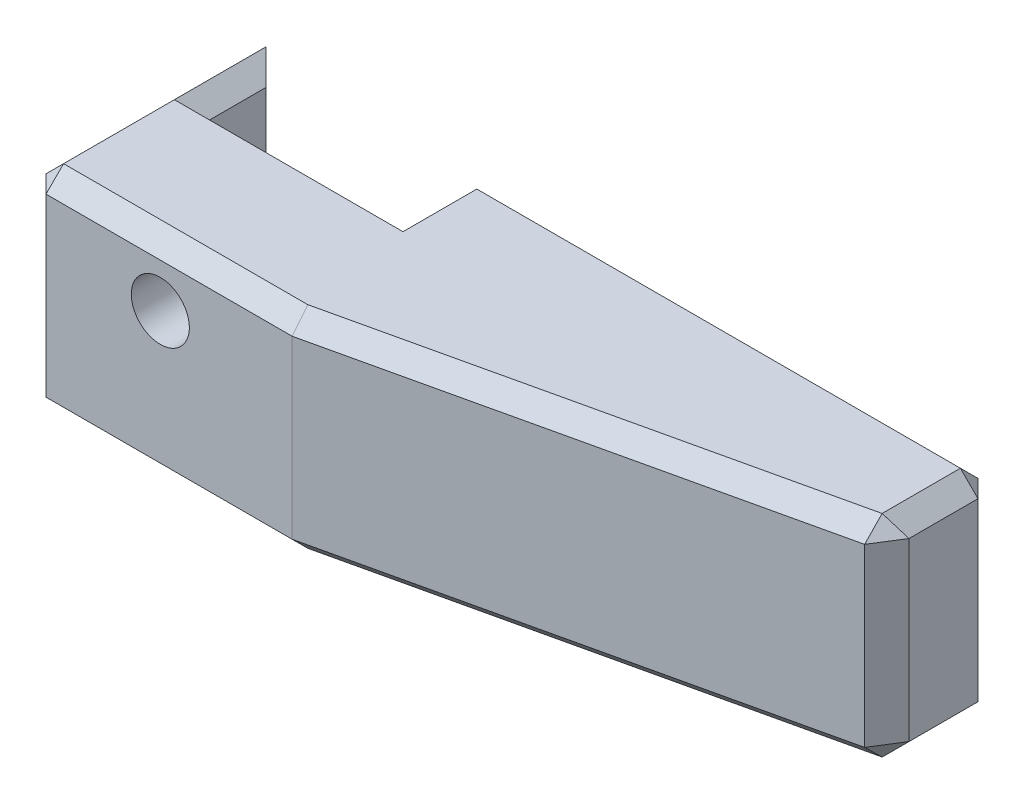
ISO-10303-21;
HEADER;
FILE_DESCRIPTION(('STEP AP214'),'2;1');
FILE_NAME('part.step','',(''),(''),'','','');
FILE_SCHEMA(('AUTOMOTIVE_DESIGN { 1 0 10303 214 1 1 1 1 }'));
ENDSEC;
DATA;
#1=APPLICATION_CONTEXT('core data for automotive mechanical design processes');
#2=APPLICATION_PROTOCOL_DEFINITION('international standard','automotive_design',2000,#1);
#3=PRODUCT_CONTEXT('',#1,'mechanical');
#4=PRODUCT('Part','Part','',(#3));
#5=PRODUCT_RELATED_PRODUCT_CATEGORY('part','',(#4));
#6=PRODUCT_DEFINITION_FORMATION('','',#4);
#7=PRODUCT_DEFINITION_CONTEXT('part definition',#1,'design');
#8=PRODUCT_DEFINITION('design','',#6,#7);
#9=PRODUCT_DEFINITION_SHAPE('','',#8);
#10=(LENGTH_UNIT() NAMED_UNIT(*) SI_UNIT(.MILLI.,.METRE.));
#11=(NAMED_UNIT(*) PLANE_ANGLE_UNIT() SI_UNIT($,.RADIAN.));
#12=(NAMED_UNIT(*) SI_UNIT($,.STERADIAN.) SOLID_ANGLE_UNIT());
#13=UNCERTAINTY_MEASURE_WITH_UNIT(LENGTH_MEASURE(1.E-05),#10,'distance_accuracy_value','');
#14=(GEOMETRIC_REPRESENTATION_CONTEXT(3) GLOBAL_UNCERTAINTY_ASSIGNED_CONTEXT((#13)) GLOBAL_UNIT_ASSIGNED_CONTEXT((#10,
#11,#12)) REPRESENTATION_CONTEXT('',''));
#15=CARTESIAN_POINT('',(0.,0.,0.));
#16=DIRECTION('',(0.,0.,1.));
#17=DIRECTION('',(1.,0.,0.));
#18=AXIS2_PLACEMENT_3D('',#15,#16,#17);
#19=CARTESIAN_POINT('',(0.,6.,33.75));
#20=DIRECTION('',(0.,0.,1.));
#21=DIRECTION('',(-1.,0.,0.));
#22=AXIS2_PLACEMENT_3D('',#19,#20,#21);
#23=PLANE('',#22);
#24=DIRECTION('',(0.,1.,0.));
#25=VECTOR('',#24,1.);
#26=CARTESIAN_POINT('',(12.,4.5,33.75));
#27=LINE('',#26,#25);
#28=CARTESIAN_POINT('',(12.,-4.5,33.75));
#29=VERTEX_POINT('',#28);
#30=CARTESIAN_POINT('',(12.,4.5,33.75));
#31=VERTEX_POINT('',#30);
#32=EDGE_CURVE('E1076',#29,#31,#27,.T.);
#33=ORIENTED_EDGE('',*,*,#32,.F.);
#34=DIRECTION('',(-1.,0.,0.));
#35=VECTOR('',#34,1.);
#36=CARTESIAN_POINT('',(12.,-4.5,33.75));
#37=LINE('',#36,#35);
#38=CARTESIAN_POINT('',(38.5,-4.5,33.75));
#39=VERTEX_POINT('',#38);
#40=EDGE_CURVE('E63',#39,#29,#37,.T.);
#41=ORIENTED_EDGE('',*,*,#40,.F.);
#42=DIRECTION('',(0.,-1.,0.));
#43=VECTOR('',#42,1.);
#44=CARTESIAN_POINT('',(38.5,-4.5,33.75));
#45=LINE('',#44,#43);
#46=CARTESIAN_POINT('',(38.5,4.5,33.75));
#47=VERTEX_POINT('',#46);
#48=EDGE_CURVE('E1085',#47,#39,#45,.T.);
#49=ORIENTED_EDGE('',*,*,#48,.F.);
#50=DIRECTION('',(1.,0.,0.));
#51=VECTOR('',#50,1.);
#52=CARTESIAN_POINT('',(38.5,4.5,33.75));
#53=LINE('',#52,#51);
#54=EDGE_CURVE('E1096',#31,#47,#53,.T.);
#55=ORIENTED_EDGE('',*,*,#54,.F.);
#56=EDGE_LOOP('',(#33,#41,#49,#55));
#57=FACE_BOUND('',#56,.T.);
#58=DIRECTION('',(0.,-1.,0.));
#59=VECTOR('',#58,1.);
#60=CARTESIAN_POINT('',(11.5,6.,33.75));
#61=LINE('',#60,#59);
#62=CARTESIAN_POINT('',(11.5,5.,33.75));
#63=VERTEX_POINT('',#62);
#64=CARTESIAN_POINT('',(11.5,-3.,33.75));
#65=VERTEX_POINT('',#64);
#66=EDGE_CURVE('E422',#63,#65,#61,.T.);
#67=ORIENTED_EDGE('',*,*,#66,.F.);
#68=DIRECTION('',(-1.,0.,0.));
#69=VECTOR('',#68,1.);
#70=CARTESIAN_POINT('',(0.,5.,33.75));
#71=LINE('',#70,#69);
#72=CARTESIAN_POINT('',(39.,5.,33.75));
#73=VERTEX_POINT('',#72);
#74=EDGE_CURVE('E413',#73,#63,#71,.T.);
#75=ORIENTED_EDGE('',*,*,#74,.F.);
#76=DIRECTION('',(0.,1.,0.));
#77=VECTOR('',#76,1.);
#78=CARTESIAN_POINT('',(39.,6.,33.75));
#79=LINE('',#78,#77);
#80=CARTESIAN_POINT('',(39.,-5.,33.75));
#81=VERTEX_POINT('',#80);
#82=EDGE_CURVE('E410',#81,#73,#79,.T.);
#83=ORIENTED_EDGE('',*,*,#82,.F.);
#84=DIRECTION('',(1.,0.,0.));
#85=VECTOR('',#84,1.);
#86=CARTESIAN_POINT('',(40.,-5.,33.75));
#87=LINE('',#86,#85);
#88=CARTESIAN_POINT('',(-1.5,-5.,33.75));
#89=VERTEX_POINT('',#88);
#90=EDGE_CURVE('E416',#89,#81,#87,.T.);
#91=ORIENTED_EDGE('',*,*,#90,.F.);
#92=DIRECTION('',(0.,-1.,0.));
#93=VECTOR('',#92,1.);
#94=CARTESIAN_POINT('',(-1.5,-6.,33.75));
#95=LINE('',#94,#93);
#96=CARTESIAN_POINT('',(-1.5,-3.,33.75));
#97=VERTEX_POINT('',#96);
#98=EDGE_CURVE('E419',#97,#89,#95,.T.);
#99=ORIENTED_EDGE('',*,*,#98,.F.);
#100=DIRECTION('',(-1.,0.,0.));
#101=VECTOR('',#100,1.);
#102=CARTESIAN_POINT('',(0.,-3.,33.75));
#103=LINE('',#102,#101);
#104=EDGE_CURVE('E425',#65,#97,#103,.T.);
#105=ORIENTED_EDGE('',*,*,#104,.F.);
#106=EDGE_LOOP('',(#67,#75,#83,#91,#99,#105));
#107=FACE_BOUND('',#106,.T.);
#108=ADVANCED_FACE('F46',(#57,#107),#23,.F.);
#109=CARTESIAN_POINT('',(40.,6.,33.75));
#110=DIRECTION('',(-1.,0.,0.));
#111=DIRECTION('',(0.,0.,-1.));
#112=AXIS2_PLACEMENT_3D('',#109,#110,#111);
#113=PLANE('',#112);
#114=DIRECTION('',(0.,-1.,0.));
#115=VECTOR('',#114,1.);
#116=CARTESIAN_POINT('',(40.,6.,34.75));
#117=LINE('',#116,#115);
#118=CARTESIAN_POINT('',(40.,5.,34.75));
#119=VERTEX_POINT('',#118);
#120=CARTESIAN_POINT('',(40.,-5.,34.75));
#121=VERTEX_POINT('',#120);
#122=EDGE_CURVE('E364',#119,#121,#117,.T.);
#123=ORIENTED_EDGE('',*,*,#122,.F.);
#124=DIRECTION('',(0.,0.,-1.));
#125=VECTOR('',#124,1.);
#126=CARTESIAN_POINT('',(40.,5.,33.75));
#127=LINE('',#126,#125);
#128=CARTESIAN_POINT('',(40.,5.,38.6728806855672));
#129=VERTEX_POINT('',#128);
#130=EDGE_CURVE('E359',#129,#119,#127,.T.);
#131=ORIENTED_EDGE('',*,*,#130,.F.);
#132=DIRECTION('',(0.,1.,0.));
#133=VECTOR('',#132,1.);
#134=CARTESIAN_POINT('',(40.,6.,38.6728806855672));
#135=LINE('',#134,#133);
#136=CARTESIAN_POINT('',(40.,-5.,38.6728806855672));
#137=VERTEX_POINT('',#136);
#138=EDGE_CURVE('E367',#137,#129,#135,.T.);
#139=ORIENTED_EDGE('',*,*,#138,.F.);
#140=DIRECTION('',(0.,0.,1.));
#141=VECTOR('',#140,1.);
#142=CARTESIAN_POINT('',(40.,-5.,40.));
#143=LINE('',#142,#141);
#144=EDGE_CURVE('E370',#121,#137,#143,.T.);
#145=ORIENTED_EDGE('',*,*,#144,.F.);
#146=EDGE_LOOP('',(#123,#131,#139,#145));
#147=FACE_BOUND('',#146,.T.);
#148=ADVANCED_FACE('F490',(#147),#113,.F.);
#149=CARTESIAN_POINT('',(0.,6.,46.25));
#150=DIRECTION('',(0.,0.,-1.));
#151=DIRECTION('',(1.,0.,0.));
#152=AXIS2_PLACEMENT_3D('',#149,#150,#151);
#153=PLANE('',#152);
#154=CARTESIAN_POINT('',(5.,2.5,46.25));
#155=DIRECTION('',(0.,0.,-1.));
#156=DIRECTION('',(-1.,0.,0.));
#157=AXIS2_PLACEMENT_3D('',#154,#155,#156);
#158=CIRCLE('',#157,1.64999999999999);
#159=CARTESIAN_POINT('',(3.35000000000001,2.5,46.25));
#160=VERTEX_POINT('',#159);
#161=EDGE_CURVE('E356',#160,#160,#158,.T.);
#162=ORIENTED_EDGE('',*,*,#161,.T.);
#163=EDGE_LOOP('',(#162));
#164=FACE_BOUND('',#163,.T.);
#165=DIRECTION('',(0.,1.,0.));
#166=VECTOR('',#165,1.);
#167=CARTESIAN_POINT('',(12.5,-6.,46.25));
#168=LINE('',#167,#166);
#169=CARTESIAN_POINT('',(12.5,-5.,46.25));
#170=VERTEX_POINT('',#169);
#171=CARTESIAN_POINT('',(12.5,5.,46.25));
#172=VERTEX_POINT('',#171);
#173=EDGE_CURVE('E353',#170,#172,#168,.T.);
#174=ORIENTED_EDGE('',*,*,#173,.T.);
#175=DIRECTION('',(1.,0.,0.));
#176=VECTOR('',#175,1.);
#177=CARTESIAN_POINT('',(0.,5.,46.25));
#178=LINE('',#177,#176);
#179=CARTESIAN_POINT('',(-1.5,5.,46.25));
#180=VERTEX_POINT('',#179);
#181=EDGE_CURVE('E253',#180,#172,#178,.T.);
#182=ORIENTED_EDGE('',*,*,#181,.F.);
#183=DIRECTION('',(0.,1.,0.));
#184=VECTOR('',#183,1.);
#185=CARTESIAN_POINT('',(-1.5,6.,46.25));
#186=LINE('',#185,#184);
#187=CARTESIAN_POINT('',(-1.5,-5.,46.25));
#188=VERTEX_POINT('',#187);
#189=EDGE_CURVE('E55',#188,#180,#186,.T.);
#190=ORIENTED_EDGE('',*,*,#189,.F.);
#191=DIRECTION('',(-1.,0.,0.));
#192=VECTOR('',#191,1.);
#193=CARTESIAN_POINT('',(-2.5,-5.,46.25));
#194=LINE('',#193,#192);
#195=EDGE_CURVE('E13',#170,#188,#194,.T.);
#196=ORIENTED_EDGE('',*,*,#195,.F.);
#197=EDGE_LOOP('',(#174,#182,#190,#196));
#198=FACE_BOUND('',#197,.T.);
#199=ADVANCED_FACE('F498',(#164,#198),#153,.F.);
#200=CARTESIAN_POINT('',(0.,6.,40.));
#201=DIRECTION('',(0.,-1.,0.));
#202=DIRECTION('',(0.,0.,1.));
#203=AXIS2_PLACEMENT_3D('',#200,#201,#202);
#204=PLANE('',#203);
#205=DIRECTION('',(0.,0.,-1.));
#206=VECTOR('',#205,1.);
#207=CARTESIAN_POINT('',(-1.5,6.,33.75));
#208=LINE('',#207,#206);
#209=CARTESIAN_POINT('',(-1.5,6.,45.25));
#210=VERTEX_POINT('',#209);
#211=CARTESIAN_POINT('',(-1.5,6.,38.95));
#212=VERTEX_POINT('',#211);
#213=EDGE_CURVE('E247',#210,#212,#208,.T.);
#214=ORIENTED_EDGE('',*,*,#213,.F.);
#215=DIRECTION('',(-1.,0.,0.));
#216=VECTOR('',#215,1.);
#217=CARTESIAN_POINT('',(0.,6.,45.25));
#218=LINE('',#217,#216);
#219=CARTESIAN_POINT('',(12.3877943309286,6.,45.25));
#220=VERTEX_POINT('',#219);
#221=EDGE_CURVE('E440',#220,#210,#218,.T.);
#222=ORIENTED_EDGE('',*,*,#221,.F.);
#223=DIRECTION('',(-0.97513285579146,0.,0.221621103588968));
#224=VECTOR('',#223,1.);
#225=CARTESIAN_POINT('',(1.74301543865072,6.,47.6692679300631));
#226=LINE('',#225,#224);
#227=CARTESIAN_POINT('',(39.,6.,39.2017714388474));
#228=VERTEX_POINT('',#227);
#229=EDGE_CURVE('E437',#228,#220,#226,.T.);
#230=ORIENTED_EDGE('',*,*,#229,.F.);
#231=DIRECTION('',(0.,0.,1.));
#232=VECTOR('',#231,1.);
#233=CARTESIAN_POINT('',(39.,6.,40.));
#234=LINE('',#233,#232);
#235=CARTESIAN_POINT('',(39.,6.,34.75));
#236=VERTEX_POINT('',#235);
#237=EDGE_CURVE('E443',#236,#228,#234,.T.);
#238=ORIENTED_EDGE('',*,*,#237,.F.);
#239=DIRECTION('',(1.,0.,0.));
#240=VECTOR('',#239,1.);
#241=CARTESIAN_POINT('',(0.,6.,34.75));
#242=LINE('',#241,#240);
#243=CARTESIAN_POINT('',(11.5,6.,34.75));
#244=VERTEX_POINT('',#243);
#245=EDGE_CURVE('E246',#244,#236,#242,.T.);
#246=ORIENTED_EDGE('',*,*,#245,.F.);
#247=DIRECTION('',(0.,0.,-1.));
#248=VECTOR('',#247,1.);
#249=CARTESIAN_POINT('',(11.5,6.,40.));
#250=LINE('',#249,#248);
#251=CARTESIAN_POINT('',(11.5,6.,38.95));
#252=VERTEX_POINT('',#251);
#253=EDGE_CURVE('E223',#252,#244,#250,.T.);
#254=ORIENTED_EDGE('',*,*,#253,.F.);
#255=DIRECTION('',(1.,0.,0.));
#256=VECTOR('',#255,1.);
#257=CARTESIAN_POINT('',(0.,6.,38.95));
#258=LINE('',#257,#256);
#259=EDGE_CURVE('E236',#212,#252,#258,.T.);
#260=ORIENTED_EDGE('',*,*,#259,.F.);
#261=EDGE_LOOP('',(#214,#222,#230,#238,#246,#254,#260));
#262=FACE_BOUND('',#261,.T.);
#263=ADVANCED_FACE('F243',(#262),#204,.F.);
#264=CARTESIAN_POINT('',(0.,-6.,40.));
#265=DIRECTION('',(0.,-1.,0.));
#266=DIRECTION('',(0.,0.,1.));
#267=AXIS2_PLACEMENT_3D('',#264,#265,#266);
#268=PLANE('',#267);
#269=DIRECTION('',(-1.,0.,0.));
#270=VECTOR('',#269,1.);
#271=CARTESIAN_POINT('',(-2.5,-6.,34.75));
#272=LINE('',#271,#270);
#273=CARTESIAN_POINT('',(39.,-6.,34.75));
#274=VERTEX_POINT('',#273);
#275=CARTESIAN_POINT('',(-1.5,-6.,34.75));
#276=VERTEX_POINT('',#275);
#277=EDGE_CURVE('E402',#274,#276,#272,.T.);
#278=ORIENTED_EDGE('',*,*,#277,.F.);
#279=DIRECTION('',(0.,0.,-1.));
#280=VECTOR('',#279,1.);
#281=CARTESIAN_POINT('',(39.,-6.,33.75));
#282=LINE('',#281,#280);
#283=CARTESIAN_POINT('',(39.,-6.,39.2017714388474));
#284=VERTEX_POINT('',#283);
#285=EDGE_CURVE('E399',#284,#274,#282,.T.);
#286=ORIENTED_EDGE('',*,*,#285,.F.);
#287=DIRECTION('',(0.97513285579146,0.,-0.221621103588968));
#288=VECTOR('',#287,1.);
#289=CARTESIAN_POINT('',(39.778378896411,-6.,39.0248671442085));
#290=LINE('',#289,#288);
#291=CARTESIAN_POINT('',(12.3877943309286,-6.,45.25));
#292=VERTEX_POINT('',#291);
#293=EDGE_CURVE('E396',#292,#284,#290,.T.);
#294=ORIENTED_EDGE('',*,*,#293,.F.);
#295=DIRECTION('',(1.,0.,0.));
#296=VECTOR('',#295,1.);
#297=CARTESIAN_POINT('',(12.5,-6.,45.25));
#298=LINE('',#297,#296);
#299=CARTESIAN_POINT('',(-1.5,-6.,45.25));
#300=VERTEX_POINT('',#299);
#301=EDGE_CURVE('E393',#300,#292,#298,.T.);
#302=ORIENTED_EDGE('',*,*,#301,.F.);
#303=DIRECTION('',(0.,0.,1.));
#304=VECTOR('',#303,1.);
#305=CARTESIAN_POINT('',(-1.5,-6.,40.));
#306=LINE('',#305,#304);
#307=EDGE_CURVE('E405',#276,#300,#306,.T.);
#308=ORIENTED_EDGE('',*,*,#307,.F.);
#309=EDGE_LOOP('',(#278,#286,#294,#302,#308));
#310=FACE_BOUND('',#309,.T.);
#311=ADVANCED_FACE('F583',(#310),#268,.T.);
#312=CARTESIAN_POINT('',(5.,2.5,46.25));
#313=DIRECTION('',(0.,0.,1.));
#314=DIRECTION('',(-1.,0.,0.));
#315=AXIS2_PLACEMENT_3D('',#312,#313,#314);
#316=CYLINDRICAL_SURFACE('',#315,1.64999999999999);
#317=CARTESIAN_POINT('',(5.,2.5,37.95));
#318=DIRECTION('',(0.,0.,-1.));
#319=DIRECTION('',(-1.,0.,0.));
#320=AXIS2_PLACEMENT_3D('',#317,#318,#319);
#321=CIRCLE('',#320,1.64999999999999);
#322=CARTESIAN_POINT('',(3.35000000000001,2.5,37.95));
#323=VERTEX_POINT('',#322);
#324=EDGE_CURVE('E348',#323,#323,#321,.F.);
#325=ORIENTED_EDGE('',*,*,#324,.F.);
#326=EDGE_LOOP('',(#325));
#327=FACE_BOUND('',#326,.T.);
#328=ORIENTED_EDGE('',*,*,#161,.F.);
#329=EDGE_LOOP('',(#328));
#330=FACE_BOUND('',#329,.T.);
#331=ADVANCED_FACE('F645',(#327,#330),#316,.F.);
#332=CARTESIAN_POINT('',(-2.5,0.,40.));
#333=DIRECTION('',(-1.,0.,0.));
#334=DIRECTION('',(0.,0.,-1.));
#335=AXIS2_PLACEMENT_3D('',#332,#333,#334);
#336=PLANE('',#335);
#337=DIRECTION('',(0.,0.,-1.));
#338=VECTOR('',#337,1.);
#339=CARTESIAN_POINT('',(-2.5,-5.,40.));
#340=LINE('',#339,#338);
#341=CARTESIAN_POINT('',(-2.5,-5.,45.25));
#342=VERTEX_POINT('',#341);
#343=CARTESIAN_POINT('',(-2.5,-5.,34.75));
#344=VERTEX_POINT('',#343);
#345=EDGE_CURVE('E388',#342,#344,#340,.T.);
#346=ORIENTED_EDGE('',*,*,#345,.F.);
#347=DIRECTION('',(0.,-1.,0.));
#348=VECTOR('',#347,1.);
#349=CARTESIAN_POINT('',(-2.5,-6.,45.25));
#350=LINE('',#349,#348);
#351=CARTESIAN_POINT('',(-2.5,5.,45.25));
#352=VERTEX_POINT('',#351);
#353=EDGE_CURVE('E382',#352,#342,#350,.T.);
#354=ORIENTED_EDGE('',*,*,#353,.F.);
#355=DIRECTION('',(0.,0.,1.));
#356=VECTOR('',#355,1.);
#357=CARTESIAN_POINT('',(-2.5,5.,46.25));
#358=LINE('',#357,#356);
#359=CARTESIAN_POINT('',(-2.5,5.,34.75));
#360=VERTEX_POINT('',#359);
#361=EDGE_CURVE('E385',#360,#352,#358,.T.);
#362=ORIENTED_EDGE('',*,*,#361,.F.);
#363=DIRECTION('',(0.,1.,0.));
#364=VECTOR('',#363,1.);
#365=CARTESIAN_POINT('',(-2.5,6.,34.75));
#366=LINE('',#365,#364);
#367=EDGE_CURVE('E391',#344,#360,#366,.T.);
#368=ORIENTED_EDGE('',*,*,#367,.F.);
#369=EDGE_LOOP('',(#346,#354,#362,#368));
#370=FACE_BOUND('',#369,.T.);
#371=ADVANCED_FACE('F576',(#370),#336,.T.);
#372=CARTESIAN_POINT('',(40.,-6.,40.));
#373=DIRECTION('',(-0.221621103588968,0.,-0.97513285579146));
#374=DIRECTION('',(0.97513285579146,0.,-0.221621103588968));
#375=AXIS2_PLACEMENT_3D('',#372,#373,#374);
#376=PLANE('',#375);
#377=DIRECTION('',(0.,-1.,0.));
#378=VECTOR('',#377,1.);
#379=CARTESIAN_POINT('',(39.0248671442085,-6.,40.221621103589));
#380=LINE('',#379,#378);
#381=CARTESIAN_POINT('',(39.0248671442085,5.,40.221621103589));
#382=VERTEX_POINT('',#381);
#383=CARTESIAN_POINT('',(39.0248671442085,-5.,40.221621103589));
#384=VERTEX_POINT('',#383);
#385=EDGE_CURVE('E376',#382,#384,#380,.T.);
#386=ORIENTED_EDGE('',*,*,#385,.F.);
#387=DIRECTION('',(0.97513285579146,0.,-0.221621103588968));
#388=VECTOR('',#387,1.);
#389=CARTESIAN_POINT('',(40.,5.,40.));
#390=LINE('',#389,#388);
#391=EDGE_CURVE('E373',#172,#382,#390,.T.);
#392=ORIENTED_EDGE('',*,*,#391,.F.);
#393=ORIENTED_EDGE('',*,*,#173,.F.);
#394=DIRECTION('',(-0.97513285579146,0.,0.221621103588968));
#395=VECTOR('',#394,1.);
#396=CARTESIAN_POINT('',(12.5,-5.,46.25));
#397=LINE('',#396,#395);
#398=EDGE_CURVE('E379',#384,#170,#397,.T.);
#399=ORIENTED_EDGE('',*,*,#398,.F.);
#400=EDGE_LOOP('',(#386,#392,#393,#399));
#401=FACE_BOUND('',#400,.T.);
#402=ADVANCED_FACE('F589',(#401),#376,.F.);
#403=CARTESIAN_POINT('',(-0.5,6.5,52.0514387744578));
#404=DIRECTION('',(-1.,0.,0.));
#405=DIRECTION('',(0.,-1.,0.));
#406=AXIS2_PLACEMENT_3D('',#403,#404,#405);
#407=PLANE('',#406);
#408=DIRECTION('',(0.,0.,-1.));
#409=VECTOR('',#408,1.);
#410=CARTESIAN_POINT('',(-0.5,5.,52.0514387744578));
#411=LINE('',#410,#409);
#412=CARTESIAN_POINT('',(-0.5,5.,37.95));
#413=VERTEX_POINT('',#412);
#414=CARTESIAN_POINT('',(-0.5,5.,34.75));
#415=VERTEX_POINT('',#414);
#416=EDGE_CURVE('E427',#413,#415,#411,.T.);
#417=ORIENTED_EDGE('',*,*,#416,.F.);
#418=DIRECTION('',(0.,-1.,0.));
#419=VECTOR('',#418,1.);
#420=CARTESIAN_POINT('',(-0.5,6.5,37.95));
#421=LINE('',#420,#419);
#422=CARTESIAN_POINT('',(-0.5,-2.,37.95));
#423=VERTEX_POINT('',#422);
#424=EDGE_CURVE('E330',#413,#423,#421,.T.);
#425=ORIENTED_EDGE('',*,*,#424,.T.);
#426=DIRECTION('',(0.,0.,-1.));
#427=VECTOR('',#426,1.);
#428=CARTESIAN_POINT('',(-0.5,-2.,52.0514387744578));
#429=LINE('',#428,#427);
#430=CARTESIAN_POINT('',(-0.5,-2.,34.75));
#431=VERTEX_POINT('',#430);
#432=EDGE_CURVE('E334',#423,#431,#429,.T.);
#433=ORIENTED_EDGE('',*,*,#432,.T.);
#434=DIRECTION('',(0.,-1.,0.));
#435=VECTOR('',#434,1.);
#436=CARTESIAN_POINT('',(-0.5,6.5,34.75));
#437=LINE('',#436,#435);
#438=EDGE_CURVE('E430',#415,#431,#437,.T.);
#439=ORIENTED_EDGE('',*,*,#438,.F.);
#440=EDGE_LOOP('',(#417,#425,#433,#439));
#441=FACE_BOUND('',#440,.T.);
#442=ADVANCED_FACE('F638',(#441),#407,.F.);
#443=CARTESIAN_POINT('',(10.5,-2.,52.0514387744578));
#444=DIRECTION('',(1.,0.,0.));
#445=DIRECTION('',(0.,0.,1.));
#446=AXIS2_PLACEMENT_3D('',#443,#444,#445);
#447=PLANE('',#446);
#448=DIRECTION('',(0.,0.,-1.));
#449=VECTOR('',#448,1.);
#450=CARTESIAN_POINT('',(10.5,-2.,52.0514387744578));
#451=LINE('',#450,#449);
#452=CARTESIAN_POINT('',(10.5,-2.,37.95));
#453=VERTEX_POINT('',#452);
#454=CARTESIAN_POINT('',(10.5,-2.,34.75));
#455=VERTEX_POINT('',#454);
#456=EDGE_CURVE('E349',#453,#455,#451,.T.);
#457=ORIENTED_EDGE('',*,*,#456,.F.);
#458=DIRECTION('',(0.,1.,0.));
#459=VECTOR('',#458,1.);
#460=CARTESIAN_POINT('',(10.5,-2.,37.95));
#461=LINE('',#460,#459);
#462=CARTESIAN_POINT('',(10.5,5.,37.95));
#463=VERTEX_POINT('',#462);
#464=EDGE_CURVE('E346',#453,#463,#461,.T.);
#465=ORIENTED_EDGE('',*,*,#464,.T.);
#466=DIRECTION('',(0.,0.,1.));
#467=VECTOR('',#466,1.);
#468=CARTESIAN_POINT('',(10.5,5.,52.0514387744578));
#469=LINE('',#468,#467);
#470=CARTESIAN_POINT('',(10.5,5.,34.75));
#471=VERTEX_POINT('',#470);
#472=EDGE_CURVE('E226',#471,#463,#469,.T.);
#473=ORIENTED_EDGE('',*,*,#472,.F.);
#474=DIRECTION('',(0.,1.,0.));
#475=VECTOR('',#474,1.);
#476=CARTESIAN_POINT('',(10.5,-2.,34.75));
#477=LINE('',#476,#475);
#478=EDGE_CURVE('E434',#455,#471,#477,.T.);
#479=ORIENTED_EDGE('',*,*,#478,.F.);
#480=EDGE_LOOP('',(#457,#465,#473,#479));
#481=FACE_BOUND('',#480,.T.);
#482=ADVANCED_FACE('F631',(#481),#447,.F.);
#483=CARTESIAN_POINT('',(0.,0.,37.95));
#484=DIRECTION('',(0.,0.,1.));
#485=DIRECTION('',(-1.,0.,0.));
#486=AXIS2_PLACEMENT_3D('',#483,#484,#485);
#487=PLANE('',#486);
#488=ORIENTED_EDGE('',*,*,#324,.T.);
#489=EDGE_LOOP('',(#488));
#490=FACE_BOUND('',#489,.T.);
#491=ORIENTED_EDGE('',*,*,#464,.F.);
#492=DIRECTION('',(1.,0.,0.));
#493=VECTOR('',#492,1.);
#494=CARTESIAN_POINT('',(-0.5,-2.,37.95));
#495=LINE('',#494,#493);
#496=EDGE_CURVE('E340',#423,#453,#495,.T.);
#497=ORIENTED_EDGE('',*,*,#496,.F.);
#498=ORIENTED_EDGE('',*,*,#424,.F.);
#499=DIRECTION('',(-1.,0.,0.));
#500=VECTOR('',#499,1.);
#501=CARTESIAN_POINT('',(0.,5.,37.95));
#502=LINE('',#501,#500);
#503=EDGE_CURVE('E241',#463,#413,#502,.T.);
#504=ORIENTED_EDGE('',*,*,#503,.F.);
#505=EDGE_LOOP('',(#491,#497,#498,#504));
#506=FACE_BOUND('',#505,.T.);
#507=ADVANCED_FACE('F625',(#490,#506),#487,.F.);
#508=CARTESIAN_POINT('',(-0.5,-2.,52.0514387744578));
#509=DIRECTION('',(0.,-1.,0.));
#510=DIRECTION('',(0.,0.,1.));
#511=AXIS2_PLACEMENT_3D('',#508,#509,#510);
#512=PLANE('',#511);
#513=ORIENTED_EDGE('',*,*,#432,.F.);
#514=ORIENTED_EDGE('',*,*,#496,.T.);
#515=ORIENTED_EDGE('',*,*,#456,.T.);
#516=DIRECTION('',(1.,0.,0.));
#517=VECTOR('',#516,1.);
#518=CARTESIAN_POINT('',(-0.499999999999994,-2.,34.75));
#519=LINE('',#518,#517);
#520=EDGE_CURVE('E408',#431,#455,#519,.T.);
#521=ORIENTED_EDGE('',*,*,#520,.F.);
#522=EDGE_LOOP('',(#513,#514,#515,#521));
#523=FACE_BOUND('',#522,.T.);
#524=ADVANCED_FACE('F621',(#523),#512,.F.);
#525=CARTESIAN_POINT('',(-0.499999999999994,-2.,34.75));
#526=DIRECTION('',(0.,-0.707106781186547,0.707106781186548));
#527=DIRECTION('',(1.,0.,0.));
#528=AXIS2_PLACEMENT_3D('',#525,#526,#527);
#529=PLANE('',#528);
#530=DIRECTION('',(0.577350269189627,-0.577350269189626,-0.577350269189625));
#531=VECTOR('',#530,1.);
#532=CARTESIAN_POINT('',(6.83333333333333,1.66666666666667,38.4166666666667));
#533=LINE('',#532,#531);
#534=EDGE_CURVE('E231',#455,#65,#533,.T.);
#535=ORIENTED_EDGE('',*,*,#534,.T.);
#536=ORIENTED_EDGE('',*,*,#104,.T.);
#537=DIRECTION('',(0.577350269189626,0.577350269189626,0.577350269189626));
#538=VECTOR('',#537,1.);
#539=CARTESIAN_POINT('',(-0.499999999999998,-2.,34.75));
#540=LINE('',#539,#538);
#541=EDGE_CURVE('E50',#97,#431,#540,.T.);
#542=ORIENTED_EDGE('',*,*,#541,.T.);
#543=ORIENTED_EDGE('',*,*,#520,.T.);
#544=EDGE_LOOP('',(#535,#536,#542,#543));
#545=FACE_BOUND('',#544,.T.);
#546=ADVANCED_FACE('F48',(#545),#529,.F.);
#547=CARTESIAN_POINT('',(0.,6.,38.95));
#548=DIRECTION('',(0.,-0.707106781186548,0.707106781186547));
#549=DIRECTION('',(1.,0.,0.));
#550=AXIS2_PLACEMENT_3D('',#547,#548,#549);
#551=PLANE('',#550);
#552=DIRECTION('',(0.577350269189626,-0.577350269189625,-0.577350269189626));
#553=VECTOR('',#552,1.);
#554=CARTESIAN_POINT('',(-1.85,6.35,39.3));
#555=LINE('',#554,#553);
#556=EDGE_CURVE('E232',#413,#212,#555,.F.);
#557=ORIENTED_EDGE('',*,*,#556,.T.);
#558=ORIENTED_EDGE('',*,*,#259,.T.);
#559=DIRECTION('',(-0.577350269189626,-0.577350269189625,-0.577350269189626));
#560=VECTOR('',#559,1.);
#561=CARTESIAN_POINT('',(7.66666666666666,2.16666666666667,35.1166666666667));
#562=LINE('',#561,#560);
#563=EDGE_CURVE('E219',#252,#463,#562,.T.);
#564=ORIENTED_EDGE('',*,*,#563,.T.);
#565=ORIENTED_EDGE('',*,*,#503,.T.);
#566=EDGE_LOOP('',(#557,#558,#564,#565));
#567=FACE_BOUND('',#566,.T.);
#568=ADVANCED_FACE('F237',(#567),#551,.F.);
#569=CARTESIAN_POINT('',(-0.5,6.5,34.75));
#570=DIRECTION('',(-0.707106781186547,0.,0.707106781186548));
#571=DIRECTION('',(0.,-1.,0.));
#572=AXIS2_PLACEMENT_3D('',#569,#570,#571);
#573=PLANE('',#572);
#574=ORIENTED_EDGE('',*,*,#541,.F.);
#575=DIRECTION('',(0.,1.,0.));
#576=VECTOR('',#575,1.);
#577=CARTESIAN_POINT('',(-1.5,6.,33.75));
#578=LINE('',#577,#576);
#579=CARTESIAN_POINT('',(-1.5,6.,33.75));
#580=VERTEX_POINT('',#579);
#581=EDGE_CURVE('E321',#97,#580,#578,.T.);
#582=ORIENTED_EDGE('',*,*,#581,.T.);
#583=DIRECTION('',(0.577350269189626,-0.577350269189625,0.577350269189626));
#584=VECTOR('',#583,1.);
#585=CARTESIAN_POINT('',(0.583333333333334,3.91666666666667,35.8333333333333));
#586=LINE('',#585,#584);
#587=EDGE_CURVE('E324',#580,#415,#586,.T.);
#588=ORIENTED_EDGE('',*,*,#587,.T.);
#589=ORIENTED_EDGE('',*,*,#438,.T.);
#590=EDGE_LOOP('',(#574,#582,#588,#589));
#591=FACE_BOUND('',#590,.T.);
#592=ADVANCED_FACE('F599',(#591),#573,.F.);
#593=CARTESIAN_POINT('',(10.5,-2.,34.75));
#594=DIRECTION('',(0.707106781186547,0.,0.707106781186548));
#595=DIRECTION('',(0.,1.,0.));
#596=AXIS2_PLACEMENT_3D('',#593,#594,#595);
#597=PLANE('',#596);
#598=ORIENTED_EDGE('',*,*,#534,.F.);
#599=ORIENTED_EDGE('',*,*,#478,.T.);
#600=DIRECTION('',(-0.707106781186548,0.,0.707106781186546));
#601=VECTOR('',#600,1.);
#602=CARTESIAN_POINT('',(10.5,5.,34.75));
#603=LINE('',#602,#601);
#604=EDGE_CURVE('E312',#471,#63,#603,.F.);
#605=ORIENTED_EDGE('',*,*,#604,.T.);
#606=ORIENTED_EDGE('',*,*,#66,.T.);
#607=EDGE_LOOP('',(#598,#599,#605,#606));
#608=FACE_BOUND('',#607,.T.);
#609=ADVANCED_FACE('F470',(#608),#597,.F.);
#610=CARTESIAN_POINT('',(11.5,6.,40.));
#611=DIRECTION('',(0.707106781186547,-0.707106781186548,0.));
#612=DIRECTION('',(0.,0.,-1.));
#613=AXIS2_PLACEMENT_3D('',#610,#611,#612);
#614=PLANE('',#613);
#615=ORIENTED_EDGE('',*,*,#563,.F.);
#616=ORIENTED_EDGE('',*,*,#253,.T.);
#617=DIRECTION('',(0.707106781186548,0.707106781186547,0.));
#618=VECTOR('',#617,1.);
#619=CARTESIAN_POINT('',(10.5,5.,34.75));
#620=LINE('',#619,#618);
#621=EDGE_CURVE('E310',#244,#471,#620,.F.);
#622=ORIENTED_EDGE('',*,*,#621,.T.);
#623=ORIENTED_EDGE('',*,*,#472,.T.);
#624=EDGE_LOOP('',(#615,#616,#622,#623));
#625=FACE_BOUND('',#624,.T.);
#626=ADVANCED_FACE('F221',(#625),#614,.F.);
#627=CARTESIAN_POINT('',(-1.5,6.,40.));
#628=DIRECTION('',(-0.707106781186547,-0.707106781186548,0.));
#629=DIRECTION('',(0.,0.,1.));
#630=AXIS2_PLACEMENT_3D('',#627,#628,#629);
#631=PLANE('',#630);
#632=ORIENTED_EDGE('',*,*,#416,.T.);
#633=ORIENTED_EDGE('',*,*,#587,.F.);
#634=DIRECTION('',(0.,0.,1.));
#635=VECTOR('',#634,1.);
#636=CARTESIAN_POINT('',(-1.5,6.,40.));
#637=LINE('',#636,#635);
#638=EDGE_CURVE('E308',#580,#212,#637,.T.);
#639=ORIENTED_EDGE('',*,*,#638,.T.);
#640=ORIENTED_EDGE('',*,*,#556,.F.);
#641=EDGE_LOOP('',(#632,#633,#639,#640));
#642=FACE_BOUND('',#641,.T.);
#643=ADVANCED_FACE('F596',(#642),#631,.F.);
#644=CARTESIAN_POINT('',(-2.5,0.,34.75));
#645=DIRECTION('',(-0.707106781186547,0.,-0.707106781186548));
#646=DIRECTION('',(0.,-1.,0.));
#647=AXIS2_PLACEMENT_3D('',#644,#645,#646);
#648=PLANE('',#647);
#649=DIRECTION('',(-0.577350269189627,-0.577350269189626,0.577350269189625));
#650=VECTOR('',#649,1.);
#651=CARTESIAN_POINT('',(-4.16666666666667,3.33333333333333,36.4166666666667));
#652=LINE('',#651,#650);
#653=EDGE_CURVE('E86',#360,#580,#652,.F.);
#654=ORIENTED_EDGE('',*,*,#653,.T.);
#655=ORIENTED_EDGE('',*,*,#581,.F.);
#656=ORIENTED_EDGE('',*,*,#98,.T.);
#657=DIRECTION('',(-0.707106781186548,0.,0.707106781186547));
#658=VECTOR('',#657,1.);
#659=CARTESIAN_POINT('',(-2.5,-5.,34.75));
#660=LINE('',#659,#658);
#661=EDGE_CURVE('E315',#89,#344,#660,.T.);
#662=ORIENTED_EDGE('',*,*,#661,.T.);
#663=ORIENTED_EDGE('',*,*,#367,.T.);
#664=EDGE_LOOP('',(#654,#655,#656,#662,#663));
#665=FACE_BOUND('',#664,.T.);
#666=ADVANCED_FACE('F600',(#665),#648,.T.);
#667=CARTESIAN_POINT('',(-2.5,-5.,40.));
#668=DIRECTION('',(0.707106781186547,0.707106781186548,0.));
#669=DIRECTION('',(0.,0.,-1.));
#670=AXIS2_PLACEMENT_3D('',#667,#668,#669);
#671=PLANE('',#670);
#672=DIRECTION('',(-0.707106781186548,0.707106781186547,0.));
#673=VECTOR('',#672,1.);
#674=CARTESIAN_POINT('',(-2.5,-5.,34.75));
#675=LINE('',#674,#673);
#676=EDGE_CURVE('E318',#344,#276,#675,.F.);
#677=ORIENTED_EDGE('',*,*,#676,.T.);
#678=ORIENTED_EDGE('',*,*,#307,.T.);
#679=DIRECTION('',(0.707106781186548,-0.707106781186547,0.));
#680=VECTOR('',#679,1.);
#681=CARTESIAN_POINT('',(-1.5,-6.,45.25));
#682=LINE('',#681,#680);
#683=EDGE_CURVE('E302',#300,#342,#682,.F.);
#684=ORIENTED_EDGE('',*,*,#683,.T.);
#685=ORIENTED_EDGE('',*,*,#345,.T.);
#686=EDGE_LOOP('',(#677,#678,#684,#685));
#687=FACE_BOUND('',#686,.T.);
#688=ADVANCED_FACE('F486',(#687),#671,.F.);
#689=CARTESIAN_POINT('',(-2.5,-5.,34.75));
#690=DIRECTION('',(-0.577350269189625,-0.577350269189627,-0.577350269189626));
#691=DIRECTION('',(0.,-0.707106781186547,0.707106781186548));
#692=AXIS2_PLACEMENT_3D('',#689,#690,#691);
#693=PLANE('',#692);
#694=ORIENTED_EDGE('',*,*,#661,.F.);
#695=DIRECTION('',(0.,0.707106781186547,-0.707106781186548));
#696=VECTOR('',#695,1.);
#697=CARTESIAN_POINT('',(-1.5,-5.5,34.25));
#698=LINE('',#697,#696);
#699=EDGE_CURVE('E300',#89,#276,#698,.F.);
#700=ORIENTED_EDGE('',*,*,#699,.T.);
#701=ORIENTED_EDGE('',*,*,#676,.F.);
#702=EDGE_LOOP('',(#694,#700,#701));
#703=FACE_BOUND('',#702,.T.);
#704=ADVANCED_FACE('F477',(#703),#693,.T.);
#705=CARTESIAN_POINT('',(10.5,5.,34.75));
#706=DIRECTION('',(-0.577350269189625,0.577350269189627,-0.577350269189626));
#707=DIRECTION('',(0.,-0.707106781186547,-0.707106781186548));
#708=AXIS2_PLACEMENT_3D('',#705,#706,#707);
#709=PLANE('',#708);
#710=ORIENTED_EDGE('',*,*,#621,.F.);
#711=DIRECTION('',(0.,-0.707106781186547,-0.707106781186548));
#712=VECTOR('',#711,1.);
#713=CARTESIAN_POINT('',(11.5,5.5,34.25));
#714=LINE('',#713,#712);
#715=EDGE_CURVE('E298',#244,#63,#714,.T.);
#716=ORIENTED_EDGE('',*,*,#715,.T.);
#717=ORIENTED_EDGE('',*,*,#604,.F.);
#718=EDGE_LOOP('',(#710,#716,#717));
#719=FACE_BOUND('',#718,.T.);
#720=ADVANCED_FACE('F474',(#719),#709,.T.);
#721=CARTESIAN_POINT('',(-2.5,5.,40.));
#722=DIRECTION('',(-0.707106781186547,0.707106781186548,0.));
#723=DIRECTION('',(0.,0.,-1.));
#724=AXIS2_PLACEMENT_3D('',#721,#722,#723);
#725=PLANE('',#724);
#726=ORIENTED_EDGE('',*,*,#638,.F.);
#727=ORIENTED_EDGE('',*,*,#653,.F.);
#728=ORIENTED_EDGE('',*,*,#361,.T.);
#729=DIRECTION('',(0.707106781186548,0.707106781186547,0.));
#730=VECTOR('',#729,1.);
#731=CARTESIAN_POINT('',(-2.5,5.,45.25));
#732=LINE('',#731,#730);
#733=EDGE_CURVE('E295',#352,#210,#732,.T.);
#734=ORIENTED_EDGE('',*,*,#733,.T.);
#735=ORIENTED_EDGE('',*,*,#213,.T.);
#736=EDGE_LOOP('',(#726,#727,#728,#734,#735));
#737=FACE_BOUND('',#736,.T.);
#738=ADVANCED_FACE('F476',(#737),#725,.T.);
#739=CARTESIAN_POINT('',(-2.5,0.,45.25));
#740=DIRECTION('',(-0.707106781186547,0.,0.707106781186548));
#741=DIRECTION('',(0.,1.,0.));
#742=AXIS2_PLACEMENT_3D('',#739,#740,#741);
#743=PLANE('',#742);
#744=DIRECTION('',(0.707106781186548,0.,0.707106781186547));
#745=VECTOR('',#744,1.);
#746=CARTESIAN_POINT('',(-2.,-5.,45.75));
#747=LINE('',#746,#745);
#748=EDGE_CURVE('E305',#342,#188,#747,.T.);
#749=ORIENTED_EDGE('',*,*,#748,.T.);
#750=ORIENTED_EDGE('',*,*,#189,.T.);
#751=DIRECTION('',(-0.707106781186548,0.,-0.707106781186547));
#752=VECTOR('',#751,1.);
#753=CARTESIAN_POINT('',(-2.5,5.,45.25));
#754=LINE('',#753,#752);
#755=EDGE_CURVE('E293',#180,#352,#754,.T.);
#756=ORIENTED_EDGE('',*,*,#755,.T.);
#757=ORIENTED_EDGE('',*,*,#353,.T.);
#758=EDGE_LOOP('',(#749,#750,#756,#757));
#759=FACE_BOUND('',#758,.T.);
#760=ADVANCED_FACE('F483',(#759),#743,.T.);
#761=CARTESIAN_POINT('',(-1.5,-6.,45.25));
#762=DIRECTION('',(-0.577350269189625,-0.577350269189627,0.577350269189626));
#763=DIRECTION('',(0.,0.707106781186547,0.707106781186548));
#764=AXIS2_PLACEMENT_3D('',#761,#762,#763);
#765=PLANE('',#764);
#766=ORIENTED_EDGE('',*,*,#683,.F.);
#767=DIRECTION('',(0.,-0.707106781186547,-0.707106781186548));
#768=VECTOR('',#767,1.);
#769=CARTESIAN_POINT('',(-1.5,-6.,45.25));
#770=LINE('',#769,#768);
#771=EDGE_CURVE('E72',#300,#188,#770,.F.);
#772=ORIENTED_EDGE('',*,*,#771,.T.);
#773=ORIENTED_EDGE('',*,*,#748,.F.);
#774=EDGE_LOOP('',(#766,#772,#773));
#775=FACE_BOUND('',#774,.T.);
#776=ADVANCED_FACE('F556',(#775),#765,.T.);
#777=CARTESIAN_POINT('',(0.,-5.,33.75));
#778=DIRECTION('',(0.,-0.707106781186548,-0.707106781186547));
#779=DIRECTION('',(-1.,0.,0.));
#780=AXIS2_PLACEMENT_3D('',#777,#778,#779);
#781=PLANE('',#780);
#782=ORIENTED_EDGE('',*,*,#699,.F.);
#783=ORIENTED_EDGE('',*,*,#90,.T.);
#784=DIRECTION('',(0.,-0.707106781186547,0.707106781186548));
#785=VECTOR('',#784,1.);
#786=CARTESIAN_POINT('',(39.,-5.,33.75));
#787=LINE('',#786,#785);
#788=EDGE_CURVE('E289',#81,#274,#787,.T.);
#789=ORIENTED_EDGE('',*,*,#788,.T.);
#790=ORIENTED_EDGE('',*,*,#277,.T.);
#791=EDGE_LOOP('',(#782,#783,#789,#790));
#792=FACE_BOUND('',#791,.T.);
#793=ADVANCED_FACE('F553',(#792),#781,.T.);
#794=CARTESIAN_POINT('',(40.,6.,34.75));
#795=DIRECTION('',(-0.707106781186547,0.,0.707106781186547));
#796=DIRECTION('',(0.,-1.,0.));
#797=AXIS2_PLACEMENT_3D('',#794,#795,#796);
#798=PLANE('',#797);
#799=DIRECTION('',(-0.707106781186548,0.,-0.707106781186548));
#800=VECTOR('',#799,1.);
#801=CARTESIAN_POINT('',(39.5,5.,34.25));
#802=LINE('',#801,#800);
#803=EDGE_CURVE('E284',#73,#119,#802,.F.);
#804=ORIENTED_EDGE('',*,*,#803,.T.);
#805=ORIENTED_EDGE('',*,*,#122,.T.);
#806=DIRECTION('',(0.707106781186548,0.,0.707106781186548));
#807=VECTOR('',#806,1.);
#808=CARTESIAN_POINT('',(39.,-5.,33.75));
#809=LINE('',#808,#807);
#810=EDGE_CURVE('E287',#121,#81,#809,.F.);
#811=ORIENTED_EDGE('',*,*,#810,.T.);
#812=ORIENTED_EDGE('',*,*,#82,.T.);
#813=EDGE_LOOP('',(#804,#805,#811,#812));
#814=FACE_BOUND('',#813,.T.);
#815=ADVANCED_FACE('F462',(#814),#798,.F.);
#816=CARTESIAN_POINT('',(0.,6.,34.75));
#817=DIRECTION('',(0.,-0.707106781186548,0.707106781186547));
#818=DIRECTION('',(1.,0.,0.));
#819=AXIS2_PLACEMENT_3D('',#816,#817,#818);
#820=PLANE('',#819);
#821=ORIENTED_EDGE('',*,*,#715,.F.);
#822=ORIENTED_EDGE('',*,*,#245,.T.);
#823=DIRECTION('',(0.,0.707106781186547,0.707106781186548));
#824=VECTOR('',#823,1.);
#825=CARTESIAN_POINT('',(39.,6.,34.75));
#826=LINE('',#825,#824);
#827=EDGE_CURVE('E282',#236,#73,#826,.F.);
#828=ORIENTED_EDGE('',*,*,#827,.T.);
#829=ORIENTED_EDGE('',*,*,#74,.T.);
#830=EDGE_LOOP('',(#821,#822,#828,#829));
#831=FACE_BOUND('',#830,.T.);
#832=ADVANCED_FACE('F446',(#831),#820,.F.);
#833=CARTESIAN_POINT('',(-2.5,5.,45.25));
#834=DIRECTION('',(-0.577350269189625,0.577350269189627,0.577350269189626));
#835=DIRECTION('',(0.,0.707106781186547,-0.707106781186548));
#836=AXIS2_PLACEMENT_3D('',#833,#834,#835);
#837=PLANE('',#836);
#838=ORIENTED_EDGE('',*,*,#755,.F.);
#839=DIRECTION('',(0.,0.707106781186547,-0.707106781186548));
#840=VECTOR('',#839,1.);
#841=CARTESIAN_POINT('',(-1.5,5.5,45.75));
#842=LINE('',#841,#840);
#843=EDGE_CURVE('E280',#180,#210,#842,.T.);
#844=ORIENTED_EDGE('',*,*,#843,.T.);
#845=ORIENTED_EDGE('',*,*,#733,.F.);
#846=EDGE_LOOP('',(#838,#844,#845));
#847=FACE_BOUND('',#846,.T.);
#848=ADVANCED_FACE('F544',(#847),#837,.T.);
#849=CARTESIAN_POINT('',(0.,-5.,46.25));
#850=DIRECTION('',(0.,-0.707106781186548,0.707106781186547));
#851=DIRECTION('',(1.,0.,0.));
#852=AXIS2_PLACEMENT_3D('',#849,#850,#851);
#853=PLANE('',#852);
#854=ORIENTED_EDGE('',*,*,#771,.F.);
#855=ORIENTED_EDGE('',*,*,#301,.T.);
#856=DIRECTION('',(-0.0790928331330484,-0.704891595831226,-0.704891595831228));
#857=VECTOR('',#856,1.);
#858=CARTESIAN_POINT('',(12.4218040468373,-5.69689841707459,45.5531015829254));
#859=LINE('',#858,#857);
#860=EDGE_CURVE('E278',#292,#170,#859,.F.);
#861=ORIENTED_EDGE('',*,*,#860,.T.);
#862=ORIENTED_EDGE('',*,*,#195,.T.);
#863=EDGE_LOOP('',(#854,#855,#861,#862));
#864=FACE_BOUND('',#863,.T.);
#865=ADVANCED_FACE('F540',(#864),#853,.T.);
#866=CARTESIAN_POINT('',(39.,-5.,33.75));
#867=DIRECTION('',(0.577350269189625,-0.577350269189626,-0.577350269189625));
#868=DIRECTION('',(0.,-0.707106781186547,0.707106781186548));
#869=AXIS2_PLACEMENT_3D('',#866,#867,#868);
#870=PLANE('',#869);
#871=ORIENTED_EDGE('',*,*,#810,.F.);
#872=DIRECTION('',(0.707106781186547,0.707106781186547,0.));
#873=VECTOR('',#872,1.);
#874=CARTESIAN_POINT('',(39.5,-5.5,34.75));
#875=LINE('',#874,#873);
#876=EDGE_CURVE('E276',#121,#274,#875,.F.);
#877=ORIENTED_EDGE('',*,*,#876,.T.);
#878=ORIENTED_EDGE('',*,*,#788,.F.);
#879=EDGE_LOOP('',(#871,#877,#878));
#880=FACE_BOUND('',#879,.T.);
#881=ADVANCED_FACE('F537',(#880),#870,.T.);
#882=CARTESIAN_POINT('',(39.,6.,34.75));
#883=DIRECTION('',(0.577350269189625,0.577350269189626,-0.577350269189625));
#884=DIRECTION('',(0.,-0.707106781186547,-0.707106781186548));
#885=AXIS2_PLACEMENT_3D('',#882,#883,#884);
#886=PLANE('',#885);
#887=ORIENTED_EDGE('',*,*,#827,.F.);
#888=DIRECTION('',(0.707106781186547,-0.707106781186547,0.));
#889=VECTOR('',#888,1.);
#890=CARTESIAN_POINT('',(39.,6.,34.75));
#891=LINE('',#890,#889);
#892=EDGE_CURVE('E274',#236,#119,#891,.T.);
#893=ORIENTED_EDGE('',*,*,#892,.T.);
#894=ORIENTED_EDGE('',*,*,#803,.F.);
#895=EDGE_LOOP('',(#887,#893,#894));
#896=FACE_BOUND('',#895,.T.);
#897=ADVANCED_FACE('F458',(#896),#886,.T.);
#898=CARTESIAN_POINT('',(0.,6.,45.25));
#899=DIRECTION('',(0.,-0.707106781186548,-0.707106781186547));
#900=DIRECTION('',(-1.,0.,0.));
#901=AXIS2_PLACEMENT_3D('',#898,#899,#900);
#902=PLANE('',#901);
#903=ORIENTED_EDGE('',*,*,#843,.F.);
#904=ORIENTED_EDGE('',*,*,#181,.T.);
#905=DIRECTION('',(-0.0790928331330484,0.704891595831226,-0.704891595831228));
#906=VECTOR('',#905,1.);
#907=CARTESIAN_POINT('',(12.3235818884205,6.57227449414523,44.6777255058548));
#908=LINE('',#907,#906);
#909=EDGE_CURVE('E272',#172,#220,#908,.T.);
#910=ORIENTED_EDGE('',*,*,#909,.T.);
#911=ORIENTED_EDGE('',*,*,#221,.T.);
#912=EDGE_LOOP('',(#903,#904,#910,#911));
#913=FACE_BOUND('',#912,.T.);
#914=ADVANCED_FACE('F530',(#913),#902,.F.);
#915=CARTESIAN_POINT('',(1.74301543865072,-6.,47.6692679300631));
#916=DIRECTION('',(0.156709785201805,-0.707106781186549,0.689523054887944));
#917=DIRECTION('',(-0.97513285579146,0.,0.221621103588968));
#918=AXIS2_PLACEMENT_3D('',#915,#916,#917);
#919=PLANE('',#918);
#920=ORIENTED_EDGE('',*,*,#860,.F.);
#921=ORIENTED_EDGE('',*,*,#293,.T.);
#922=DIRECTION('',(0.017407447107763,0.700017941818603,0.713913063276781));
#923=VECTOR('',#922,1.);
#924=CARTESIAN_POINT('',(39.0248671442085,-5.,40.221621103589));
#925=LINE('',#924,#923);
#926=EDGE_CURVE('E269',#284,#384,#925,.T.);
#927=ORIENTED_EDGE('',*,*,#926,.T.);
#928=ORIENTED_EDGE('',*,*,#398,.T.);
#929=EDGE_LOOP('',(#920,#921,#927,#928));
#930=FACE_BOUND('',#929,.T.);
#931=ADVANCED_FACE('F526',(#930),#919,.T.);
#932=CARTESIAN_POINT('',(40.,-5.,33.75));
#933=DIRECTION('',(0.707106781186547,-0.707106781186547,0.));
#934=DIRECTION('',(0.,0.,-1.));
#935=AXIS2_PLACEMENT_3D('',#932,#933,#934);
#936=PLANE('',#935);
#937=ORIENTED_EDGE('',*,*,#876,.F.);
#938=ORIENTED_EDGE('',*,*,#144,.T.);
#939=DIRECTION('',(-0.662306059141053,-0.662306059141053,0.350287550521133));
#940=VECTOR('',#939,1.);
#941=CARTESIAN_POINT('',(39.2129546306916,-5.78704536930837,39.0891417038064));
#942=LINE('',#941,#940);
#943=EDGE_CURVE('E267',#137,#284,#942,.T.);
#944=ORIENTED_EDGE('',*,*,#943,.T.);
#945=ORIENTED_EDGE('',*,*,#285,.T.);
#946=EDGE_LOOP('',(#937,#938,#944,#945));
#947=FACE_BOUND('',#946,.T.);
#948=ADVANCED_FACE('F523',(#947),#936,.T.);
#949=CARTESIAN_POINT('',(39.,6.,40.));
#950=DIRECTION('',(-0.707106781186547,-0.707106781186547,0.));
#951=DIRECTION('',(0.,0.,1.));
#952=AXIS2_PLACEMENT_3D('',#949,#950,#951);
#953=PLANE('',#952);
#954=ORIENTED_EDGE('',*,*,#892,.F.);
#955=ORIENTED_EDGE('',*,*,#237,.T.);
#956=DIRECTION('',(-0.662306059141054,0.662306059141054,0.350287550521132));
#957=VECTOR('',#956,1.);
#958=CARTESIAN_POINT('',(40.,5.,38.6728806855672));
#959=LINE('',#958,#957);
#960=EDGE_CURVE('E264',#228,#129,#959,.F.);
#961=ORIENTED_EDGE('',*,*,#960,.T.);
#962=ORIENTED_EDGE('',*,*,#130,.T.);
#963=EDGE_LOOP('',(#954,#955,#961,#962));
#964=FACE_BOUND('',#963,.T.);
#965=ADVANCED_FACE('F453',(#964),#953,.F.);
#966=CARTESIAN_POINT('',(40.,5.,40.));
#967=DIRECTION('',(-0.156709785201805,-0.707106781186549,-0.689523054887944));
#968=DIRECTION('',(0.97513285579146,0.,-0.221621103588968));
#969=AXIS2_PLACEMENT_3D('',#966,#967,#968);
#970=PLANE('',#969);
#971=ORIENTED_EDGE('',*,*,#909,.F.);
#972=ORIENTED_EDGE('',*,*,#391,.T.);
#973=DIRECTION('',(0.0174074471077639,-0.700017941818603,0.713913063276781));
#974=VECTOR('',#973,1.);
#975=CARTESIAN_POINT('',(39.0059158055076,5.76210354281253,39.4443900609533));
#976=LINE('',#975,#974);
#977=EDGE_CURVE('E262',#382,#228,#976,.F.);
#978=ORIENTED_EDGE('',*,*,#977,.T.);
#979=ORIENTED_EDGE('',*,*,#229,.T.);
#980=EDGE_LOOP('',(#971,#972,#978,#979));
#981=FACE_BOUND('',#980,.T.);
#982=ADVANCED_FACE('F516',(#981),#970,.F.);
#983=CARTESIAN_POINT('',(39.0248671442085,-5.,40.221621103589));
#984=DIRECTION('',(0.736946406570249,-0.491539355397398,0.464003293025715));
#985=DIRECTION('',(0.554889118212947,0.831924315360994,0.));
#986=AXIS2_PLACEMENT_3D('',#983,#984,#985);
#987=PLANE('',#986);
#988=ORIENTED_EDGE('',*,*,#943,.F.);
#989=DIRECTION('',(-0.532813269686142,0.,0.846232840089749));
#990=VECTOR('',#989,1.);
#991=CARTESIAN_POINT('',(39.0248671442085,-5.,40.221621103589));
#992=LINE('',#991,#990);
#993=EDGE_CURVE('E260',#137,#384,#992,.T.);
#994=ORIENTED_EDGE('',*,*,#993,.T.);
#995=ORIENTED_EDGE('',*,*,#926,.F.);
#996=EDGE_LOOP('',(#988,#994,#995));
#997=FACE_BOUND('',#996,.T.);
#998=ADVANCED_FACE('F512',(#997),#987,.T.);
#999=CARTESIAN_POINT('',(40.,5.,38.6728806855672));
#1000=DIRECTION('',(0.736946406570248,0.491539355397399,0.464003293025715));
#1001=DIRECTION('',(-0.554889118212947,0.831924315360994,0.));
#1002=AXIS2_PLACEMENT_3D('',#999,#1000,#1001);
#1003=PLANE('',#1002);
#1004=ORIENTED_EDGE('',*,*,#977,.F.);
#1005=DIRECTION('',(0.532813269686142,0.,-0.846232840089749));
#1006=VECTOR('',#1005,1.);
#1007=CARTESIAN_POINT('',(40.,5.,38.6728806855672));
#1008=LINE('',#1007,#1006);
#1009=EDGE_CURVE('E258',#382,#129,#1008,.T.);
#1010=ORIENTED_EDGE('',*,*,#1009,.T.);
#1011=ORIENTED_EDGE('',*,*,#960,.F.);
#1012=EDGE_LOOP('',(#1004,#1010,#1011));
#1013=FACE_BOUND('',#1012,.T.);
#1014=ADVANCED_FACE('F508',(#1013),#1003,.T.);
#1015=CARTESIAN_POINT('',(40.,6.,38.6728806855672));
#1016=DIRECTION('',(-0.846232840089749,0.,-0.532813269686142));
#1017=DIRECTION('',(0.,1.,0.));
#1018=AXIS2_PLACEMENT_3D('',#1015,#1016,#1017);
#1019=PLANE('',#1018);
#1020=ORIENTED_EDGE('',*,*,#993,.F.);
#1021=ORIENTED_EDGE('',*,*,#138,.T.);
#1022=ORIENTED_EDGE('',*,*,#1009,.F.);
#1023=ORIENTED_EDGE('',*,*,#385,.T.);
#1024=EDGE_LOOP('',(#1020,#1021,#1022,#1023));
#1025=FACE_BOUND('',#1024,.T.);
#1026=ADVANCED_FACE('F504',(#1025),#1019,.F.);
#1027=CARTESIAN_POINT('',(12.,-4.5,34.75));
#1028=DIRECTION('',(0.,-1.,0.));
#1029=DIRECTION('',(0.,0.,-1.));
#1030=AXIS2_PLACEMENT_3D('',#1027,#1028,#1029);
#1031=PLANE('',#1030);
#1032=ORIENTED_EDGE('',*,*,#40,.T.);
#1033=DIRECTION('',(0.,0.,-1.));
#1034=VECTOR('',#1033,1.);
#1035=CARTESIAN_POINT('',(12.,-4.5,34.75));
#1036=LINE('',#1035,#1034);
#1037=CARTESIAN_POINT('',(12.,-4.5,34.75));
#1038=VERTEX_POINT('',#1037);
#1039=EDGE_CURVE('E344',#1038,#29,#1036,.T.);
#1040=ORIENTED_EDGE('',*,*,#1039,.F.);
#1041=DIRECTION('',(-1.,0.,0.));
#1042=VECTOR('',#1041,1.);
#1043=CARTESIAN_POINT('',(12.,-4.5,34.75));
#1044=LINE('',#1043,#1042);
#1045=CARTESIAN_POINT('',(38.5,-4.5,34.75));
#1046=VERTEX_POINT('',#1045);
#1047=EDGE_CURVE('E1081',#1046,#1038,#1044,.T.);
#1048=ORIENTED_EDGE('',*,*,#1047,.F.);
#1049=DIRECTION('',(0.,0.,-1.));
#1050=VECTOR('',#1049,1.);
#1051=CARTESIAN_POINT('',(38.5,-4.5,34.75));
#1052=LINE('',#1051,#1050);
#1053=EDGE_CURVE('E97',#1046,#39,#1052,.T.);
#1054=ORIENTED_EDGE('',*,*,#1053,.T.);
#1055=EDGE_LOOP('',(#1032,#1040,#1048,#1054));
#1056=FACE_BOUND('',#1055,.T.);
#1057=ADVANCED_FACE('F507',(#1056),#1031,.F.);
#1058=CARTESIAN_POINT('',(38.5,-4.5,34.75));
#1059=DIRECTION('',(1.,0.,0.));
#1060=DIRECTION('',(0.,0.,-1.));
#1061=AXIS2_PLACEMENT_3D('',#1058,#1059,#1060);
#1062=PLANE('',#1061);
#1063=ORIENTED_EDGE('',*,*,#48,.T.);
#1064=ORIENTED_EDGE('',*,*,#1053,.F.);
#1065=DIRECTION('',(0.,-1.,0.));
#1066=VECTOR('',#1065,1.);
#1067=CARTESIAN_POINT('',(38.5,-4.5,34.75));
#1068=LINE('',#1067,#1066);
#1069=CARTESIAN_POINT('',(38.5,4.5,34.75));
#1070=VERTEX_POINT('',#1069);
#1071=EDGE_CURVE('E1091',#1070,#1046,#1068,.T.);
#1072=ORIENTED_EDGE('',*,*,#1071,.F.);
#1073=DIRECTION('',(0.,0.,-1.));
#1074=VECTOR('',#1073,1.);
#1075=CARTESIAN_POINT('',(38.5,4.5,34.75));
#1076=LINE('',#1075,#1074);
#1077=EDGE_CURVE('E1101',#1070,#47,#1076,.T.);
#1078=ORIENTED_EDGE('',*,*,#1077,.T.);
#1079=EDGE_LOOP('',(#1063,#1064,#1072,#1078));
#1080=FACE_BOUND('',#1079,.T.);
#1081=ADVANCED_FACE('F893',(#1080),#1062,.F.);
#1082=CARTESIAN_POINT('',(38.5,4.5,34.75));
#1083=DIRECTION('',(0.,1.,0.));
#1084=DIRECTION('',(0.,0.,1.));
#1085=AXIS2_PLACEMENT_3D('',#1082,#1083,#1084);
#1086=PLANE('',#1085);
#1087=ORIENTED_EDGE('',*,*,#54,.T.);
#1088=ORIENTED_EDGE('',*,*,#1077,.F.);
#1089=DIRECTION('',(1.,0.,0.));
#1090=VECTOR('',#1089,1.);
#1091=CARTESIAN_POINT('',(38.5,4.5,34.75));
#1092=LINE('',#1091,#1090);
#1093=CARTESIAN_POINT('',(12.,4.5,34.75));
#1094=VERTEX_POINT('',#1093);
#1095=EDGE_CURVE('E1088',#1094,#1070,#1092,.T.);
#1096=ORIENTED_EDGE('',*,*,#1095,.F.);
#1097=DIRECTION('',(0.,0.,-1.));
#1098=VECTOR('',#1097,1.);
#1099=CARTESIAN_POINT('',(12.,4.5,34.75));
#1100=LINE('',#1099,#1098);
#1101=EDGE_CURVE('E1102',#1094,#31,#1100,.T.);
#1102=ORIENTED_EDGE('',*,*,#1101,.T.);
#1103=EDGE_LOOP('',(#1087,#1088,#1096,#1102));
#1104=FACE_BOUND('',#1103,.T.);
#1105=ADVANCED_FACE('F898',(#1104),#1086,.F.);
#1106=CARTESIAN_POINT('',(12.,4.5,34.75));
#1107=DIRECTION('',(-1.,0.,0.));
#1108=DIRECTION('',(0.,0.,1.));
#1109=AXIS2_PLACEMENT_3D('',#1106,#1107,#1108);
#1110=PLANE('',#1109);
#1111=ORIENTED_EDGE('',*,*,#32,.T.);
#1112=ORIENTED_EDGE('',*,*,#1101,.F.);
#1113=DIRECTION('',(0.,1.,0.));
#1114=VECTOR('',#1113,1.);
#1115=CARTESIAN_POINT('',(12.,-3.,34.75));
#1116=LINE('',#1115,#1114);
#1117=EDGE_CURVE('E1084',#1038,#1094,#1116,.T.);
#1118=ORIENTED_EDGE('',*,*,#1117,.F.);
#1119=ORIENTED_EDGE('',*,*,#1039,.T.);
#1120=EDGE_LOOP('',(#1111,#1112,#1118,#1119));
#1121=FACE_BOUND('',#1120,.T.);
#1122=ADVANCED_FACE('F905',(#1121),#1110,.F.);
#1123=CARTESIAN_POINT('',(0.,0.,34.75));
#1124=DIRECTION('',(0.,0.,1.));
#1125=DIRECTION('',(1.,0.,0.));
#1126=AXIS2_PLACEMENT_3D('',#1123,#1124,#1125);
#1127=PLANE('',#1126);
#1128=CARTESIAN_POINT('',(30.,0.,34.75));
#1129=DIRECTION('',(0.,0.,-1.));
#1130=DIRECTION('',(-1.,0.,0.));
#1131=AXIS2_PLACEMENT_3D('',#1128,#1129,#1130);
#1132=CIRCLE('',#1131,1.975);
#1133=CARTESIAN_POINT('',(28.025,0.,34.75));
#1134=VERTEX_POINT('',#1133);
#1135=EDGE_CURVE('E1074',#1134,#1134,#1132,.T.);
#1136=ORIENTED_EDGE('',*,*,#1135,.F.);
#1137=EDGE_LOOP('',(#1136));
#1138=FACE_BOUND('',#1137,.T.);
#1139=ORIENTED_EDGE('',*,*,#1047,.T.);
#1140=ORIENTED_EDGE('',*,*,#1117,.T.);
#1141=ORIENTED_EDGE('',*,*,#1095,.T.);
#1142=ORIENTED_EDGE('',*,*,#1071,.T.);
#1143=EDGE_LOOP('',(#1139,#1140,#1141,#1142));
#1144=FACE_BOUND('',#1143,.T.);
#1145=ADVANCED_FACE('F913',(#1138,#1144),#1127,.F.);
#1146=CARTESIAN_POINT('',(30.,0.,37.73));
#1147=DIRECTION('',(0.,0.,-1.));
#1148=DIRECTION('',(-1.,0.,0.));
#1149=AXIS2_PLACEMENT_3D('',#1146,#1147,#1148);
#1150=CYLINDRICAL_SURFACE('',#1149,1.975);
#1151=CARTESIAN_POINT('',(30.,0.,37.73));
#1152=DIRECTION('',(0.,0.,-1.));
#1153=DIRECTION('',(-1.,0.,0.));
#1154=AXIS2_PLACEMENT_3D('',#1151,#1152,#1153);
#1155=CIRCLE('',#1154,1.975);
#1156=CARTESIAN_POINT('',(28.025,0.,37.73));
#1157=VERTEX_POINT('',#1156);
#1158=EDGE_CURVE('E1073',#1157,#1157,#1155,.T.);
#1159=ORIENTED_EDGE('',*,*,#1158,.F.);
#1160=EDGE_LOOP('',(#1159));
#1161=FACE_BOUND('',#1160,.T.);
#1162=ORIENTED_EDGE('',*,*,#1135,.T.);
#1163=EDGE_LOOP('',(#1162));
#1164=FACE_BOUND('',#1163,.T.);
#1165=ADVANCED_FACE('F921',(#1161,#1164),#1150,.F.);
#1166=CARTESIAN_POINT('',(30.,0.,37.73));
#1167=DIRECTION('',(0.,0.,-1.));
#1168=DIRECTION('',(-1.,0.,0.));
#1169=AXIS2_PLACEMENT_3D('',#1166,#1167,#1168);
#1170=PLANE('',#1169);
#1171=ORIENTED_EDGE('',*,*,#1158,.T.);
#1172=EDGE_LOOP('',(#1171));
#1173=FACE_BOUND('',#1172,.T.);
#1174=ADVANCED_FACE('F929',(#1173),#1170,.T.);
#1175=CLOSED_SHELL('',(#108,#148,#199,#263,#311,#331,#371,#402,#442,#482,#507,#524,#546,#568,
#592,#609,#626,#643,#666,#688,#704,#720,#738,#760,#776,#793,#815,#832,#848,#865,#881,#897,#914,
#931,#948,#965,#982,#998,#1014,#1026,#1057,#1081,#1105,#1122,#1145,#1165,#1174));
#1176=MANIFOLD_SOLID_BREP('B2',#1175);
#1177=ADVANCED_BREP_SHAPE_REPRESENTATION('',(#18,#1176),#14);
#1178=SHAPE_DEFINITION_REPRESENTATION(#9,#1177);
ENDSEC;
END-ISO-10303-21;
